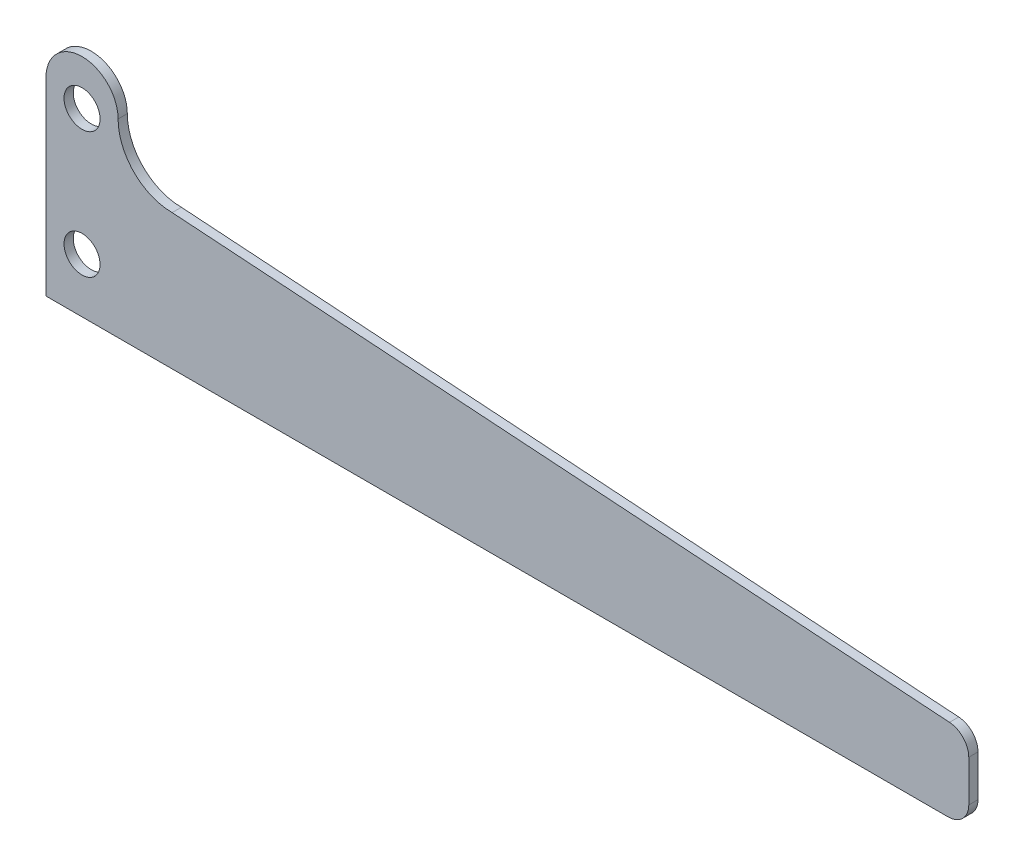
ISO-10303-21;
HEADER;
FILE_DESCRIPTION(('STEP AP214'),'2;1');
FILE_NAME('part.step','',(''),(''),'','','');
FILE_SCHEMA(('AUTOMOTIVE_DESIGN { 1 0 10303 214 1 1 1 1 }'));
ENDSEC;
DATA;
#1=APPLICATION_CONTEXT('core data for automotive mechanical design processes');
#2=APPLICATION_PROTOCOL_DEFINITION('international standard','automotive_design',2000,#1);
#3=PRODUCT_CONTEXT('',#1,'mechanical');
#4=PRODUCT('Part','Part','',(#3));
#5=PRODUCT_RELATED_PRODUCT_CATEGORY('part','',(#4));
#6=PRODUCT_DEFINITION_FORMATION('','',#4);
#7=PRODUCT_DEFINITION_CONTEXT('part definition',#1,'design');
#8=PRODUCT_DEFINITION('design','',#6,#7);
#9=PRODUCT_DEFINITION_SHAPE('','',#8);
#10=(LENGTH_UNIT() NAMED_UNIT(*) SI_UNIT(.MILLI.,.METRE.));
#11=(NAMED_UNIT(*) PLANE_ANGLE_UNIT() SI_UNIT($,.RADIAN.));
#12=(NAMED_UNIT(*) SI_UNIT($,.STERADIAN.) SOLID_ANGLE_UNIT());
#13=UNCERTAINTY_MEASURE_WITH_UNIT(LENGTH_MEASURE(1.E-05),#10,'distance_accuracy_value','');
#14=(GEOMETRIC_REPRESENTATION_CONTEXT(3) GLOBAL_UNCERTAINTY_ASSIGNED_CONTEXT((#13)) GLOBAL_UNIT_ASSIGNED_CONTEXT((#10,
#11,#12)) REPRESENTATION_CONTEXT('',''));
#15=CARTESIAN_POINT('',(0.,0.,0.));
#16=DIRECTION('',(0.,0.,1.));
#17=DIRECTION('',(1.,0.,0.));
#18=AXIS2_PLACEMENT_3D('',#15,#16,#17);
#19=CARTESIAN_POINT('',(0.,-0.8128,0.8128));
#20=DIRECTION('',(0.,1.,0.));
#21=DIRECTION('',(0.,0.,1.));
#22=AXIS2_PLACEMENT_3D('',#19,#20,#21);
#23=PLANE('',#22);
#24=DIRECTION('',(1.,0.,0.));
#25=VECTOR('',#24,1.);
#26=CARTESIAN_POINT('',(0.,-0.8128,0.));
#27=LINE('',#26,#25);
#28=CARTESIAN_POINT('',(0.,-0.8128,0.));
#29=VERTEX_POINT('',#28);
#30=CARTESIAN_POINT('',(79.4618949788643,-0.8128,0.));
#31=VERTEX_POINT('',#30);
#32=EDGE_CURVE('E154',#29,#31,#27,.T.);
#33=ORIENTED_EDGE('',*,*,#32,.T.);
#34=DIRECTION('',(0.,0.,-1.));
#35=VECTOR('',#34,1.);
#36=CARTESIAN_POINT('',(79.4618949788643,-0.8128,0.8128));
#37=LINE('',#36,#35);
#38=CARTESIAN_POINT('',(79.4618949788643,-0.8128,0.8128));
#39=VERTEX_POINT('',#38);
#40=EDGE_CURVE('E11',#39,#31,#37,.T.);
#41=ORIENTED_EDGE('',*,*,#40,.F.);
#42=DIRECTION('',(1.,0.,0.));
#43=VECTOR('',#42,1.);
#44=CARTESIAN_POINT('',(0.,-0.8128,0.8128));
#45=LINE('',#44,#43);
#46=CARTESIAN_POINT('',(0.,-0.8128,0.8128));
#47=VERTEX_POINT('',#46);
#48=EDGE_CURVE('E190',#47,#39,#45,.T.);
#49=ORIENTED_EDGE('',*,*,#48,.F.);
#50=DIRECTION('',(0.,0.,-1.));
#51=VECTOR('',#50,1.);
#52=CARTESIAN_POINT('',(0.,-0.8128,0.8128));
#53=LINE('',#52,#51);
#54=EDGE_CURVE('E58',#47,#29,#53,.T.);
#55=ORIENTED_EDGE('',*,*,#54,.T.);
#56=EDGE_LOOP('',(#33,#41,#49,#55));
#57=FACE_BOUND('',#56,.T.);
#58=ADVANCED_FACE('F41',(#57),#23,.F.);
#59=CARTESIAN_POINT('',(79.4618949788643,1.00774342113573,0.8128));
#60=DIRECTION('',(0.,0.,-1.));
#61=DIRECTION('',(-1.,0.,0.));
#62=AXIS2_PLACEMENT_3D('',#59,#60,#61);
#63=CYLINDRICAL_SURFACE('',#62,1.82054342113573);
#64=CARTESIAN_POINT('',(79.4618949788643,1.00774342113573,0.));
#65=DIRECTION('',(0.,0.,1.));
#66=DIRECTION('',(1.,0.,0.));
#67=AXIS2_PLACEMENT_3D('',#64,#65,#66);
#68=CIRCLE('',#67,1.82054342113573);
#69=CARTESIAN_POINT('',(81.2824384,1.00774342113573,0.));
#70=VERTEX_POINT('',#69);
#71=EDGE_CURVE('E157',#31,#70,#68,.T.);
#72=ORIENTED_EDGE('',*,*,#71,.T.);
#73=DIRECTION('',(0.,0.,-1.));
#74=VECTOR('',#73,1.);
#75=CARTESIAN_POINT('',(81.2824384,1.00774342113573,0.8128));
#76=LINE('',#75,#74);
#77=CARTESIAN_POINT('',(81.2824384,1.00774342113573,0.8128));
#78=VERTEX_POINT('',#77);
#79=EDGE_CURVE('E50',#78,#70,#76,.T.);
#80=ORIENTED_EDGE('',*,*,#79,.F.);
#81=CARTESIAN_POINT('',(79.4618949788643,1.00774342113573,0.8128));
#82=DIRECTION('',(0.,0.,1.));
#83=DIRECTION('',(1.,0.,0.));
#84=AXIS2_PLACEMENT_3D('',#81,#82,#83);
#85=CIRCLE('',#84,1.82054342113573);
#86=EDGE_CURVE('E97',#39,#78,#85,.T.);
#87=ORIENTED_EDGE('',*,*,#86,.F.);
#88=ORIENTED_EDGE('',*,*,#40,.T.);
#89=EDGE_LOOP('',(#72,#80,#87,#88));
#90=FACE_BOUND('',#89,.T.);
#91=ADVANCED_FACE('F209',(#90),#63,.T.);
#92=CARTESIAN_POINT('',(81.2824384,0.,0.8128));
#93=DIRECTION('',(1.,0.,0.));
#94=DIRECTION('',(0.,0.,-1.));
#95=AXIS2_PLACEMENT_3D('',#92,#93,#94);
#96=PLANE('',#95);
#97=DIRECTION('',(0.,-1.,0.));
#98=VECTOR('',#97,1.);
#99=CARTESIAN_POINT('',(81.2824384,0.,0.));
#100=LINE('',#99,#98);
#101=CARTESIAN_POINT('',(81.2824384,4.64883026340719,0.));
#102=VERTEX_POINT('',#101);
#103=EDGE_CURVE('E161',#102,#70,#100,.T.);
#104=ORIENTED_EDGE('',*,*,#103,.F.);
#105=DIRECTION('',(0.,0.,-1.));
#106=VECTOR('',#105,1.);
#107=CARTESIAN_POINT('',(81.2824384,4.64883026340719,0.8128));
#108=LINE('',#107,#106);
#109=CARTESIAN_POINT('',(81.2824384,4.64883026340719,0.8128));
#110=VERTEX_POINT('',#109);
#111=EDGE_CURVE('E200',#110,#102,#108,.T.);
#112=ORIENTED_EDGE('',*,*,#111,.F.);
#113=DIRECTION('',(0.,-1.,0.));
#114=VECTOR('',#113,1.);
#115=CARTESIAN_POINT('',(81.2824384,0.,0.8128));
#116=LINE('',#115,#114);
#117=EDGE_CURVE('E208',#110,#78,#116,.T.);
#118=ORIENTED_EDGE('',*,*,#117,.T.);
#119=ORIENTED_EDGE('',*,*,#79,.T.);
#120=EDGE_LOOP('',(#104,#112,#118,#119));
#121=FACE_BOUND('',#120,.T.);
#122=ADVANCED_FACE('F206',(#121),#96,.T.);
#123=CARTESIAN_POINT('',(79.4618949788643,4.64883026340719,0.8128));
#124=DIRECTION('',(0.,0.,-1.));
#125=DIRECTION('',(-1.,0.,0.));
#126=AXIS2_PLACEMENT_3D('',#123,#124,#125);
#127=CYLINDRICAL_SURFACE('',#126,1.82054342113573);
#128=CARTESIAN_POINT('',(79.4618949788643,4.64883026340719,0.));
#129=DIRECTION('',(0.,0.,1.));
#130=DIRECTION('',(1.,0.,0.));
#131=AXIS2_PLACEMENT_3D('',#128,#129,#130);
#132=CIRCLE('',#131,1.82054342113573);
#133=CARTESIAN_POINT('',(79.5851733679352,6.4651949809209,0.));
#134=VERTEX_POINT('',#133);
#135=EDGE_CURVE('E165',#102,#134,#132,.T.);
#136=ORIENTED_EDGE('',*,*,#135,.T.);
#137=DIRECTION('',(0.,0.,-1.));
#138=VECTOR('',#137,1.);
#139=CARTESIAN_POINT('',(79.5851733679352,6.4651949809209,0.8128));
#140=LINE('',#139,#138);
#141=CARTESIAN_POINT('',(79.5851733679352,6.4651949809209,0.8128));
#142=VERTEX_POINT('',#141);
#143=EDGE_CURVE('E197',#142,#134,#140,.T.);
#144=ORIENTED_EDGE('',*,*,#143,.F.);
#145=CARTESIAN_POINT('',(79.4618949788643,4.64883026340719,0.8128));
#146=DIRECTION('',(0.,0.,1.));
#147=DIRECTION('',(1.,0.,0.));
#148=AXIS2_PLACEMENT_3D('',#145,#146,#147);
#149=CIRCLE('',#148,1.82054342113573);
#150=EDGE_CURVE('E140',#110,#142,#149,.T.);
#151=ORIENTED_EDGE('',*,*,#150,.F.);
#152=ORIENTED_EDGE('',*,*,#111,.T.);
#153=EDGE_LOOP('',(#136,#144,#151,#152));
#154=FACE_BOUND('',#153,.T.);
#155=ADVANCED_FACE('F218',(#154),#127,.T.);
#156=CARTESIAN_POINT('',(0.801712156130444,11.8123029102791,0.8128));
#157=DIRECTION('',(0.0677151600119668,0.997704694338236,0.));
#158=DIRECTION('',(-0.997704694338237,0.0677151600119668,0.));
#159=AXIS2_PLACEMENT_3D('',#156,#157,#158);
#160=PLANE('',#159);
#161=DIRECTION('',(0.997704694338236,-0.0677151600119668,0.));
#162=VECTOR('',#161,1.);
#163=CARTESIAN_POINT('',(0.801712156130444,11.8123029102791,0.));
#164=LINE('',#163,#162);
#165=CARTESIAN_POINT('',(11.1125,11.1125,0.));
#166=VERTEX_POINT('',#165);
#167=EDGE_CURVE('E169',#166,#134,#164,.T.);
#168=ORIENTED_EDGE('',*,*,#167,.F.);
#169=DIRECTION('',(0.,0.,-1.));
#170=VECTOR('',#169,1.);
#171=CARTESIAN_POINT('',(11.1125,11.1125,0.8128));
#172=LINE('',#171,#170);
#173=CARTESIAN_POINT('',(11.1125,11.1125,0.8128));
#174=VERTEX_POINT('',#173);
#175=EDGE_CURVE('E123',#174,#166,#172,.T.);
#176=ORIENTED_EDGE('',*,*,#175,.F.);
#177=DIRECTION('',(0.997704694338236,-0.0677151600119668,0.));
#178=VECTOR('',#177,1.);
#179=CARTESIAN_POINT('',(0.801712156130444,11.8123029102791,0.8128));
#180=LINE('',#179,#178);
#181=EDGE_CURVE('E136',#174,#142,#180,.T.);
#182=ORIENTED_EDGE('',*,*,#181,.T.);
#183=ORIENTED_EDGE('',*,*,#143,.T.);
#184=EDGE_LOOP('',(#168,#176,#182,#183));
#185=FACE_BOUND('',#184,.T.);
#186=ADVANCED_FACE('F252',(#185),#160,.T.);
#187=CARTESIAN_POINT('',(11.1125,15.875,0.8128));
#188=DIRECTION('',(0.,0.,-1.));
#189=DIRECTION('',(-1.,0.,0.));
#190=AXIS2_PLACEMENT_3D('',#187,#188,#189);
#191=CYLINDRICAL_SURFACE('',#190,4.76250000000001);
#192=CARTESIAN_POINT('',(11.1125,15.875,0.));
#193=DIRECTION('',(0.,0.,1.));
#194=DIRECTION('',(1.,0.,0.));
#195=AXIS2_PLACEMENT_3D('',#192,#193,#194);
#196=CIRCLE('',#195,4.76250000000001);
#197=CARTESIAN_POINT('',(6.34999999999999,15.875,0.));
#198=VERTEX_POINT('',#197);
#199=EDGE_CURVE('E119',#198,#166,#196,.T.);
#200=ORIENTED_EDGE('',*,*,#199,.F.);
#201=DIRECTION('',(0.,0.,-1.));
#202=VECTOR('',#201,1.);
#203=CARTESIAN_POINT('',(6.34999999999999,15.875,0.8128));
#204=LINE('',#203,#202);
#205=CARTESIAN_POINT('',(6.34999999999999,15.875,0.8128));
#206=VERTEX_POINT('',#205);
#207=EDGE_CURVE('E113',#206,#198,#204,.T.);
#208=ORIENTED_EDGE('',*,*,#207,.F.);
#209=CARTESIAN_POINT('',(11.1125,15.875,0.8128));
#210=DIRECTION('',(0.,0.,1.));
#211=DIRECTION('',(1.,0.,0.));
#212=AXIS2_PLACEMENT_3D('',#209,#210,#211);
#213=CIRCLE('',#212,4.76250000000001);
#214=EDGE_CURVE('E117',#206,#174,#213,.T.);
#215=ORIENTED_EDGE('',*,*,#214,.T.);
#216=ORIENTED_EDGE('',*,*,#175,.T.);
#217=EDGE_LOOP('',(#200,#208,#215,#216));
#218=FACE_BOUND('',#217,.T.);
#219=ADVANCED_FACE('F115',(#218),#191,.F.);
#220=CARTESIAN_POINT('',(3.17499999999999,15.875,0.8128));
#221=DIRECTION('',(0.,0.,-1.));
#222=DIRECTION('',(-1.,0.,0.));
#223=AXIS2_PLACEMENT_3D('',#220,#221,#222);
#224=CYLINDRICAL_SURFACE('',#223,3.17499999999999);
#225=CARTESIAN_POINT('',(3.17499999999999,15.875,0.));
#226=DIRECTION('',(0.,0.,1.));
#227=DIRECTION('',(1.,0.,0.));
#228=AXIS2_PLACEMENT_3D('',#225,#226,#227);
#229=CIRCLE('',#228,3.17499999999999);
#230=CARTESIAN_POINT('',(0.,15.875,0.));
#231=VERTEX_POINT('',#230);
#232=EDGE_CURVE('E175',#198,#231,#229,.T.);
#233=ORIENTED_EDGE('',*,*,#232,.T.);
#234=DIRECTION('',(0.,0.,-1.));
#235=VECTOR('',#234,1.);
#236=CARTESIAN_POINT('',(0.,15.875,0.8128));
#237=LINE('',#236,#235);
#238=CARTESIAN_POINT('',(0.,15.875,0.8128));
#239=VERTEX_POINT('',#238);
#240=EDGE_CURVE('E85',#239,#231,#237,.T.);
#241=ORIENTED_EDGE('',*,*,#240,.F.);
#242=CARTESIAN_POINT('',(3.17499999999999,15.875,0.8128));
#243=DIRECTION('',(0.,0.,1.));
#244=DIRECTION('',(1.,0.,0.));
#245=AXIS2_PLACEMENT_3D('',#242,#243,#244);
#246=CIRCLE('',#245,3.17499999999999);
#247=EDGE_CURVE('E125',#206,#239,#246,.T.);
#248=ORIENTED_EDGE('',*,*,#247,.F.);
#249=ORIENTED_EDGE('',*,*,#207,.T.);
#250=EDGE_LOOP('',(#233,#241,#248,#249));
#251=FACE_BOUND('',#250,.T.);
#252=ADVANCED_FACE('F126',(#251),#224,.T.);
#253=CARTESIAN_POINT('',(3.17499999999999,15.08125,0.8128));
#254=DIRECTION('',(0.,0.,-1.));
#255=DIRECTION('',(-1.,0.,0.));
#256=AXIS2_PLACEMENT_3D('',#253,#254,#255);
#257=CYLINDRICAL_SURFACE('',#256,1.5875);
#258=CARTESIAN_POINT('',(3.17499999999999,15.08125,0.8128));
#259=DIRECTION('',(0.,0.,1.));
#260=DIRECTION('',(1.,0.,0.));
#261=AXIS2_PLACEMENT_3D('',#258,#259,#260);
#262=CIRCLE('',#261,1.5875);
#263=CARTESIAN_POINT('',(4.76249999999999,15.08125,0.8128));
#264=VERTEX_POINT('',#263);
#265=EDGE_CURVE('E146',#264,#264,#262,.T.);
#266=ORIENTED_EDGE('',*,*,#265,.T.);
#267=EDGE_LOOP('',(#266));
#268=FACE_BOUND('',#267,.T.);
#269=CARTESIAN_POINT('',(3.17499999999999,15.08125,0.));
#270=DIRECTION('',(0.,0.,1.));
#271=DIRECTION('',(1.,0.,0.));
#272=AXIS2_PLACEMENT_3D('',#269,#270,#271);
#273=CIRCLE('',#272,1.5875);
#274=CARTESIAN_POINT('',(4.76249999999999,15.08125,0.));
#275=VERTEX_POINT('',#274);
#276=EDGE_CURVE('E182',#275,#275,#273,.T.);
#277=ORIENTED_EDGE('',*,*,#276,.F.);
#278=EDGE_LOOP('',(#277));
#279=FACE_BOUND('',#278,.T.);
#280=ADVANCED_FACE('F230',(#268,#279),#257,.F.);
#281=CARTESIAN_POINT('',(0.,0.,0.8128));
#282=DIRECTION('',(-1.,0.,0.));
#283=DIRECTION('',(0.,0.,1.));
#284=AXIS2_PLACEMENT_3D('',#281,#282,#283);
#285=PLANE('',#284);
#286=DIRECTION('',(0.,1.,0.));
#287=VECTOR('',#286,1.);
#288=CARTESIAN_POINT('',(0.,0.,0.));
#289=LINE('',#288,#287);
#290=EDGE_CURVE('E178',#29,#231,#289,.T.);
#291=ORIENTED_EDGE('',*,*,#290,.F.);
#292=ORIENTED_EDGE('',*,*,#54,.F.);
#293=DIRECTION('',(0.,1.,0.));
#294=VECTOR('',#293,1.);
#295=CARTESIAN_POINT('',(0.,0.,0.8128));
#296=LINE('',#295,#294);
#297=EDGE_CURVE('E130',#47,#239,#296,.T.);
#298=ORIENTED_EDGE('',*,*,#297,.T.);
#299=ORIENTED_EDGE('',*,*,#240,.T.);
#300=EDGE_LOOP('',(#291,#292,#298,#299));
#301=FACE_BOUND('',#300,.T.);
#302=ADVANCED_FACE('F227',(#301),#285,.T.);
#303=CARTESIAN_POINT('',(3.17499999999999,3.96875,0.8128));
#304=DIRECTION('',(0.,0.,-1.));
#305=DIRECTION('',(-1.,0.,0.));
#306=AXIS2_PLACEMENT_3D('',#303,#304,#305);
#307=CYLINDRICAL_SURFACE('',#306,1.5875);
#308=CARTESIAN_POINT('',(3.17499999999999,3.96875,0.8128));
#309=DIRECTION('',(0.,0.,1.));
#310=DIRECTION('',(1.,0.,0.));
#311=AXIS2_PLACEMENT_3D('',#308,#309,#310);
#312=CIRCLE('',#311,1.5875);
#313=CARTESIAN_POINT('',(4.7625,3.96875,0.8128));
#314=VERTEX_POINT('',#313);
#315=EDGE_CURVE('E150',#314,#314,#312,.T.);
#316=ORIENTED_EDGE('',*,*,#315,.T.);
#317=EDGE_LOOP('',(#316));
#318=FACE_BOUND('',#317,.T.);
#319=CARTESIAN_POINT('',(3.17499999999999,3.96875,0.));
#320=DIRECTION('',(0.,0.,1.));
#321=DIRECTION('',(1.,0.,0.));
#322=AXIS2_PLACEMENT_3D('',#319,#320,#321);
#323=CIRCLE('',#322,1.5875);
#324=CARTESIAN_POINT('',(4.7625,3.96875,0.));
#325=VERTEX_POINT('',#324);
#326=EDGE_CURVE('E186',#325,#325,#323,.T.);
#327=ORIENTED_EDGE('',*,*,#326,.F.);
#328=EDGE_LOOP('',(#327));
#329=FACE_BOUND('',#328,.T.);
#330=ADVANCED_FACE('F229',(#318,#329),#307,.F.);
#331=CARTESIAN_POINT('',(0.,0.,0.8128));
#332=DIRECTION('',(0.,0.,1.));
#333=DIRECTION('',(1.,0.,0.));
#334=AXIS2_PLACEMENT_3D('',#331,#332,#333);
#335=PLANE('',#334);
#336=ORIENTED_EDGE('',*,*,#48,.T.);
#337=ORIENTED_EDGE('',*,*,#86,.T.);
#338=ORIENTED_EDGE('',*,*,#117,.F.);
#339=ORIENTED_EDGE('',*,*,#150,.T.);
#340=ORIENTED_EDGE('',*,*,#181,.F.);
#341=ORIENTED_EDGE('',*,*,#214,.F.);
#342=ORIENTED_EDGE('',*,*,#247,.T.);
#343=ORIENTED_EDGE('',*,*,#297,.F.);
#344=EDGE_LOOP('',(#336,#337,#338,#339,#340,#341,#342,#343));
#345=FACE_BOUND('',#344,.T.);
#346=ORIENTED_EDGE('',*,*,#265,.F.);
#347=EDGE_LOOP('',(#346));
#348=FACE_BOUND('',#347,.T.);
#349=ORIENTED_EDGE('',*,*,#315,.F.);
#350=EDGE_LOOP('',(#349));
#351=FACE_BOUND('',#350,.T.);
#352=ADVANCED_FACE('F133',(#345,#348,#351),#335,.T.);
#353=CARTESIAN_POINT('',(0.,0.,0.));
#354=DIRECTION('',(0.,0.,1.));
#355=DIRECTION('',(1.,0.,0.));
#356=AXIS2_PLACEMENT_3D('',#353,#354,#355);
#357=PLANE('',#356);
#358=ORIENTED_EDGE('',*,*,#32,.F.);
#359=ORIENTED_EDGE('',*,*,#290,.T.);
#360=ORIENTED_EDGE('',*,*,#232,.F.);
#361=ORIENTED_EDGE('',*,*,#199,.T.);
#362=ORIENTED_EDGE('',*,*,#167,.T.);
#363=ORIENTED_EDGE('',*,*,#135,.F.);
#364=ORIENTED_EDGE('',*,*,#103,.T.);
#365=ORIENTED_EDGE('',*,*,#71,.F.);
#366=EDGE_LOOP('',(#358,#359,#360,#361,#362,#363,#364,#365));
#367=FACE_BOUND('',#366,.T.);
#368=ORIENTED_EDGE('',*,*,#276,.T.);
#369=EDGE_LOOP('',(#368));
#370=FACE_BOUND('',#369,.T.);
#371=ORIENTED_EDGE('',*,*,#326,.T.);
#372=EDGE_LOOP('',(#371));
#373=FACE_BOUND('',#372,.T.);
#374=ADVANCED_FACE('F213',(#367,#370,#373),#357,.F.);
#375=CLOSED_SHELL('',(#58,#91,#122,#155,#186,#219,#252,#280,#302,#330,#352,#374));
#376=MANIFOLD_SOLID_BREP('B2',#375);
#377=ADVANCED_BREP_SHAPE_REPRESENTATION('',(#18,#376),#14);
#378=SHAPE_DEFINITION_REPRESENTATION(#9,#377);
ENDSEC;
END-ISO-10303-21;
